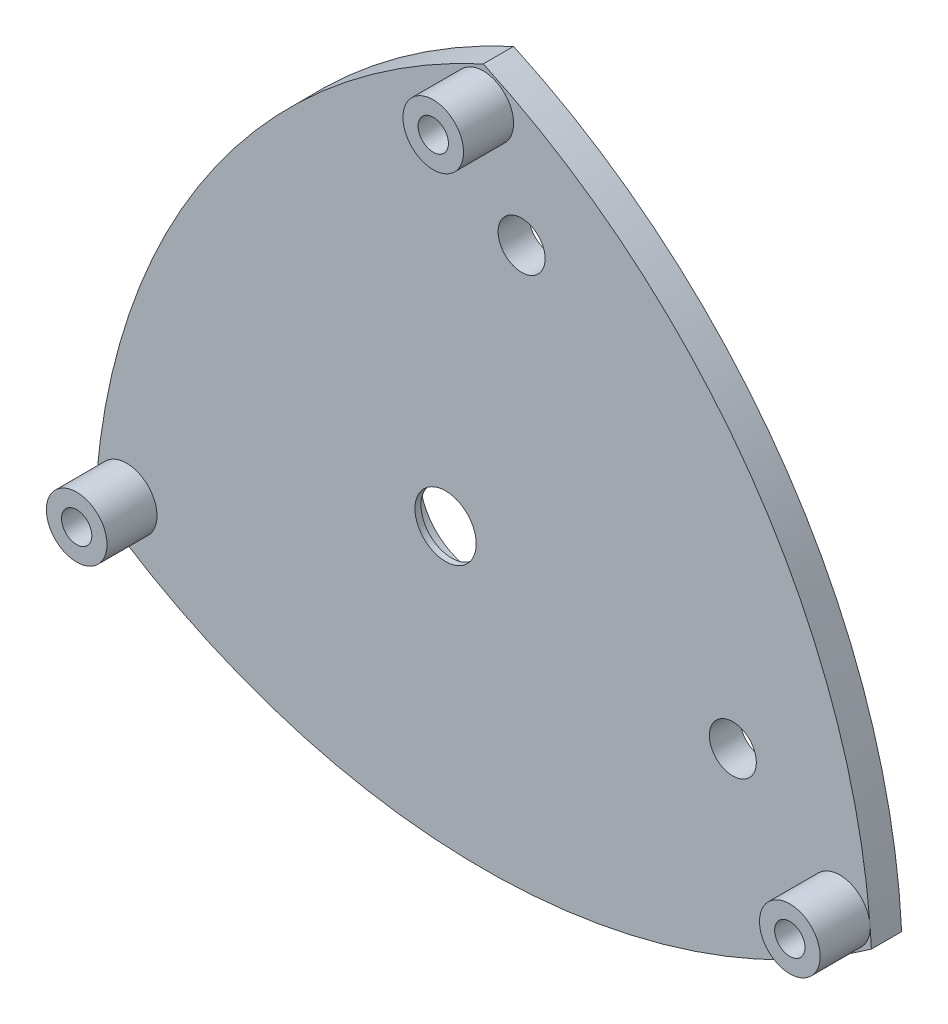
ISO-10303-21;
HEADER;
FILE_DESCRIPTION(('STEP AP214'),'2;1');
FILE_NAME('part.step','',(''),(''),'','','');
FILE_SCHEMA(('AUTOMOTIVE_DESIGN { 1 0 10303 214 1 1 1 1 }'));
ENDSEC;
DATA;
#1=APPLICATION_CONTEXT('core data for automotive mechanical design processes');
#2=APPLICATION_PROTOCOL_DEFINITION('international standard','automotive_design',2000,#1);
#3=PRODUCT_CONTEXT('',#1,'mechanical');
#4=PRODUCT('Part','Part','',(#3));
#5=PRODUCT_RELATED_PRODUCT_CATEGORY('part','',(#4));
#6=PRODUCT_DEFINITION_FORMATION('','',#4);
#7=PRODUCT_DEFINITION_CONTEXT('part definition',#1,'design');
#8=PRODUCT_DEFINITION('design','',#6,#7);
#9=PRODUCT_DEFINITION_SHAPE('','',#8);
#10=(LENGTH_UNIT() NAMED_UNIT(*) SI_UNIT(.MILLI.,.METRE.));
#11=(NAMED_UNIT(*) PLANE_ANGLE_UNIT() SI_UNIT($,.RADIAN.));
#12=(NAMED_UNIT(*) SI_UNIT($,.STERADIAN.) SOLID_ANGLE_UNIT());
#13=UNCERTAINTY_MEASURE_WITH_UNIT(LENGTH_MEASURE(1.E-05),#10,'distance_accuracy_value','');
#14=(GEOMETRIC_REPRESENTATION_CONTEXT(3) GLOBAL_UNCERTAINTY_ASSIGNED_CONTEXT((#13)) GLOBAL_UNIT_ASSIGNED_CONTEXT((#10,
#11,#12)) REPRESENTATION_CONTEXT('',''));
#15=CARTESIAN_POINT('',(0.,0.,0.));
#16=DIRECTION('',(0.,0.,1.));
#17=DIRECTION('',(1.,0.,0.));
#18=AXIS2_PLACEMENT_3D('',#15,#16,#17);
#19=CARTESIAN_POINT('',(-12.4288761987484,-23.2988029932106,10.));
#20=DIRECTION('',(0.,0.,-1.));
#21=DIRECTION('',(-1.,0.,0.));
#22=AXIS2_PLACEMENT_3D('',#19,#20,#21);
#23=CYLINDRICAL_SURFACE('',#22,18.50000000005);
#24=CARTESIAN_POINT('',(-12.4288761987484,-23.2988029932106,0.));
#25=DIRECTION('',(0.,0.,-1.));
#26=DIRECTION('',(-1.,0.,0.));
#27=AXIS2_PLACEMENT_3D('',#24,#25,#26);
#28=CIRCLE('',#27,18.50000000005);
#29=CARTESIAN_POINT('',(-30.9288761987984,-23.2988029932106,0.));
#30=VERTEX_POINT('',#29);
#31=EDGE_CURVE('E234',#30,#30,#28,.T.);
#32=ORIENTED_EDGE('',*,*,#31,.T.);
#33=EDGE_LOOP('',(#32));
#34=FACE_BOUND('',#33,.T.);
#35=CARTESIAN_POINT('',(-12.4288761987484,-23.2988029932106,8.));
#36=DIRECTION('',(0.,0.,1.));
#37=DIRECTION('',(1.,0.,0.));
#38=AXIS2_PLACEMENT_3D('',#35,#36,#37);
#39=CIRCLE('',#38,18.50000000005);
#40=CARTESIAN_POINT('',(6.07112380130153,-23.2988029932106,8.));
#41=VERTEX_POINT('',#40);
#42=EDGE_CURVE('E11',#41,#41,#39,.F.);
#43=ORIENTED_EDGE('',*,*,#42,.F.);
#44=EDGE_LOOP('',(#43));
#45=FACE_BOUND('',#44,.T.);
#46=ADVANCED_FACE('F35',(#34,#45),#23,.F.);
#47=CARTESIAN_POINT('',(-45.84945921808,10.0108651432086,10.));
#48=DIRECTION('',(0.,0.,1.));
#49=DIRECTION('',(1.,0.,0.));
#50=AXIS2_PLACEMENT_3D('',#47,#48,#49);
#51=PLANE('',#50);
#52=CARTESIAN_POINT('',(-12.4288761987484,-23.2988029932106,10.));
#53=DIRECTION('',(0.,0.,1.));
#54=DIRECTION('',(1.,0.,0.));
#55=AXIS2_PLACEMENT_3D('',#52,#53,#54);
#56=CIRCLE('',#55,10.10000000005);
#57=CARTESIAN_POINT('',(-2.32887619869847,-23.2988029932106,10.));
#58=VERTEX_POINT('',#57);
#59=EDGE_CURVE('E39',#58,#58,#56,.T.);
#60=ORIENTED_EDGE('',*,*,#59,.F.);
#61=EDGE_LOOP('',(#60));
#62=FACE_BOUND('',#61,.T.);
#63=CARTESIAN_POINT('',(12.6509950664096,69.515536741389,10.));
#64=DIRECTION('',(0.,0.,1.));
#65=DIRECTION('',(1.,0.,0.));
#66=AXIS2_PLACEMENT_3D('',#63,#64,#65);
#67=CIRCLE('',#66,7.75);
#68=CARTESIAN_POINT('',(20.4009950664096,69.515536741389,10.));
#69=VERTEX_POINT('',#68);
#70=EDGE_CURVE('E223',#69,#69,#67,.T.);
#71=ORIENTED_EDGE('',*,*,#70,.F.);
#72=EDGE_LOOP('',(#71));
#73=FACE_BOUND('',#72,.T.);
#74=CARTESIAN_POINT('',(82.3341256154374,-39.5307187826996,10.));
#75=DIRECTION('',(0.,0.,1.));
#76=DIRECTION('',(1.,0.,0.));
#77=AXIS2_PLACEMENT_3D('',#74,#75,#76);
#78=CIRCLE('',#77,7.74999999998308);
#79=CARTESIAN_POINT('',(90.0841256154205,-39.5307187826996,10.));
#80=VERTEX_POINT('',#79);
#81=EDGE_CURVE('E225',#80,#80,#78,.T.);
#82=ORIENTED_EDGE('',*,*,#81,.F.);
#83=EDGE_LOOP('',(#82));
#84=FACE_BOUND('',#83,.T.);
#85=CARTESIAN_POINT('',(0.,103.,10.));
#86=DIRECTION('',(0.,0.,1.));
#87=DIRECTION('',(1.,0.,0.));
#88=AXIS2_PLACEMENT_3D('',#85,#86,#87);
#89=CIRCLE('',#88,10.);
#90=CARTESIAN_POINT('',(9.99999999999999,103.,10.));
#91=VERTEX_POINT('',#90);
#92=EDGE_CURVE('E124',#91,#91,#89,.T.);
#93=ORIENTED_EDGE('',*,*,#92,.F.);
#94=EDGE_LOOP('',(#93));
#95=FACE_BOUND('',#94,.T.);
#96=CARTESIAN_POINT('',(-91.6989184361599,-84.9782697135829,10.));
#97=DIRECTION('',(0.,0.,1.));
#98=DIRECTION('',(1.,0.,0.));
#99=AXIS2_PLACEMENT_3D('',#96,#97,#98);
#100=CIRCLE('',#99,220.);
#101=CARTESIAN_POINT('',(128.022678921713,-73.9139281378286,10.));
#102=VERTEX_POINT('',#101);
#103=CARTESIAN_POINT('',(127.62978060665,-67.8049830104328,10.));
#104=VERTEX_POINT('',#103);
#105=EDGE_CURVE('E88',#102,#104,#100,.T.);
#106=ORIENTED_EDGE('',*,*,#105,.T.);
#107=CARTESIAN_POINT('',(117.630374076299,-67.9139281378286,10.));
#108=DIRECTION('',(0.,0.,1.));
#109=DIRECTION('',(1.,0.,0.));
#110=AXIS2_PLACEMENT_3D('',#107,#108,#109);
#111=CIRCLE('',#110,9.99999999999999);
#112=CARTESIAN_POINT('',(127.515403429057,-66.4019113736614,10.));
#113=VERTEX_POINT('',#112);
#114=EDGE_CURVE('E92',#113,#104,#111,.T.);
#115=ORIENTED_EDGE('',*,*,#114,.F.);
#116=CARTESIAN_POINT('',(0.,115.,10.));
#117=VERTEX_POINT('',#116);
#118=EDGE_CURVE('E82',#113,#117,#100,.T.);
#119=ORIENTED_EDGE('',*,*,#118,.T.);
#120=CARTESIAN_POINT('',(91.6989184361599,-84.9782697135829,10.));
#121=DIRECTION('',(0.,0.,1.));
#122=DIRECTION('',(-1.,0.,0.));
#123=AXIS2_PLACEMENT_3D('',#120,#121,#122);
#124=CIRCLE('',#123,220.);
#125=CARTESIAN_POINT('',(-127.515403429057,-66.4019113736608,10.));
#126=VERTEX_POINT('',#125);
#127=EDGE_CURVE('E143',#117,#126,#124,.T.);
#128=ORIENTED_EDGE('',*,*,#127,.T.);
#129=CARTESIAN_POINT('',(-117.630374076299,-67.9139281378286,10.));
#130=DIRECTION('',(0.,0.,1.));
#131=DIRECTION('',(1.,0.,0.));
#132=AXIS2_PLACEMENT_3D('',#129,#130,#131);
#133=CIRCLE('',#132,9.99999999999999);
#134=CARTESIAN_POINT('',(-127.62978060665,-67.8049830104333,10.));
#135=VERTEX_POINT('',#134);
#136=EDGE_CURVE('E113',#135,#126,#133,.T.);
#137=ORIENTED_EDGE('',*,*,#136,.F.);
#138=CARTESIAN_POINT('',(-128.022678921713,-73.9139281378286,10.));
#139=VERTEX_POINT('',#138);
#140=EDGE_CURVE('E142',#135,#139,#124,.T.);
#141=ORIENTED_EDGE('',*,*,#140,.T.);
#142=CARTESIAN_POINT('',(0.,105.,10.));
#143=DIRECTION('',(0.,0.,1.));
#144=DIRECTION('',(1.,0.,0.));
#145=AXIS2_PLACEMENT_3D('',#142,#143,#144);
#146=CIRCLE('',#145,220.);
#147=EDGE_CURVE('E89',#139,#102,#146,.T.);
#148=ORIENTED_EDGE('',*,*,#147,.T.);
#149=EDGE_LOOP('',(#106,#115,#119,#128,#137,#141,#148));
#150=FACE_BOUND('',#149,.T.);
#151=ADVANCED_FACE('F93',(#62,#73,#84,#95,#150),#51,.T.);
#152=CARTESIAN_POINT('',(-45.84945921808,10.0108651432086,0.));
#153=DIRECTION('',(0.,0.,1.));
#154=DIRECTION('',(1.,0.,0.));
#155=AXIS2_PLACEMENT_3D('',#152,#153,#154);
#156=PLANE('',#155);
#157=ORIENTED_EDGE('',*,*,#31,.F.);
#158=EDGE_LOOP('',(#157));
#159=FACE_BOUND('',#158,.T.);
#160=CARTESIAN_POINT('',(12.6509950664096,69.515536741389,0.));
#161=DIRECTION('',(0.,0.,-1.));
#162=DIRECTION('',(-1.,0.,0.));
#163=AXIS2_PLACEMENT_3D('',#160,#161,#162);
#164=CIRCLE('',#163,7.75);
#165=CARTESIAN_POINT('',(4.9009950664096,69.515536741389,0.));
#166=VERTEX_POINT('',#165);
#167=EDGE_CURVE('E230',#166,#166,#164,.T.);
#168=ORIENTED_EDGE('',*,*,#167,.F.);
#169=EDGE_LOOP('',(#168));
#170=FACE_BOUND('',#169,.T.);
#171=CARTESIAN_POINT('',(82.3341256154374,-39.5307187826996,0.));
#172=DIRECTION('',(0.,0.,-1.));
#173=DIRECTION('',(-1.,0.,0.));
#174=AXIS2_PLACEMENT_3D('',#171,#172,#173);
#175=CIRCLE('',#174,7.74999999998308);
#176=CARTESIAN_POINT('',(74.5841256154543,-39.5307187826996,0.));
#177=VERTEX_POINT('',#176);
#178=EDGE_CURVE('E231',#177,#177,#175,.T.);
#179=ORIENTED_EDGE('',*,*,#178,.F.);
#180=EDGE_LOOP('',(#179));
#181=FACE_BOUND('',#180,.T.);
#182=CARTESIAN_POINT('',(0.,105.,0.));
#183=DIRECTION('',(0.,0.,1.));
#184=DIRECTION('',(1.,0.,0.));
#185=AXIS2_PLACEMENT_3D('',#182,#183,#184);
#186=CIRCLE('',#185,220.);
#187=CARTESIAN_POINT('',(-128.022678921713,-73.9139281378286,0.));
#188=VERTEX_POINT('',#187);
#189=CARTESIAN_POINT('',(128.022678921713,-73.9139281378286,0.));
#190=VERTEX_POINT('',#189);
#191=EDGE_CURVE('E139',#188,#190,#186,.T.);
#192=ORIENTED_EDGE('',*,*,#191,.F.);
#193=CARTESIAN_POINT('',(91.6989184361599,-84.9782697135829,0.));
#194=DIRECTION('',(0.,0.,1.));
#195=DIRECTION('',(-1.,0.,0.));
#196=AXIS2_PLACEMENT_3D('',#193,#194,#195);
#197=CIRCLE('',#196,220.);
#198=CARTESIAN_POINT('',(0.,115.,0.));
#199=VERTEX_POINT('',#198);
#200=EDGE_CURVE('E140',#199,#188,#197,.T.);
#201=ORIENTED_EDGE('',*,*,#200,.F.);
#202=CARTESIAN_POINT('',(-91.6989184361599,-84.9782697135829,0.));
#203=DIRECTION('',(0.,0.,1.));
#204=DIRECTION('',(1.,0.,0.));
#205=AXIS2_PLACEMENT_3D('',#202,#203,#204);
#206=CIRCLE('',#205,220.);
#207=EDGE_CURVE('E148',#190,#199,#206,.T.);
#208=ORIENTED_EDGE('',*,*,#207,.F.);
#209=EDGE_LOOP('',(#192,#201,#208));
#210=FACE_BOUND('',#209,.T.);
#211=CARTESIAN_POINT('',(-117.630374076299,-67.9139281378286,0.));
#212=DIRECTION('',(0.,0.,1.));
#213=DIRECTION('',(1.,0.,0.));
#214=AXIS2_PLACEMENT_3D('',#211,#212,#213);
#215=CIRCLE('',#214,5.00000000000002);
#216=CARTESIAN_POINT('',(-112.630374076299,-67.9139281378286,0.));
#217=VERTEX_POINT('',#216);
#218=EDGE_CURVE('E136',#217,#217,#215,.T.);
#219=ORIENTED_EDGE('',*,*,#218,.T.);
#220=EDGE_LOOP('',(#219));
#221=FACE_BOUND('',#220,.T.);
#222=CARTESIAN_POINT('',(117.630374076299,-67.9139281378286,0.));
#223=DIRECTION('',(0.,0.,1.));
#224=DIRECTION('',(1.,0.,0.));
#225=AXIS2_PLACEMENT_3D('',#222,#223,#224);
#226=CIRCLE('',#225,5.00000000000013);
#227=CARTESIAN_POINT('',(122.630374076299,-67.9139281378286,0.));
#228=VERTEX_POINT('',#227);
#229=EDGE_CURVE('E133',#228,#228,#226,.T.);
#230=ORIENTED_EDGE('',*,*,#229,.T.);
#231=EDGE_LOOP('',(#230));
#232=FACE_BOUND('',#231,.T.);
#233=CARTESIAN_POINT('',(0.,103.,0.));
#234=DIRECTION('',(0.,0.,1.));
#235=DIRECTION('',(1.,0.,0.));
#236=AXIS2_PLACEMENT_3D('',#233,#234,#235);
#237=CIRCLE('',#236,5.00000000000001);
#238=CARTESIAN_POINT('',(5.,103.,0.));
#239=VERTEX_POINT('',#238);
#240=EDGE_CURVE('E128',#239,#239,#237,.T.);
#241=ORIENTED_EDGE('',*,*,#240,.T.);
#242=EDGE_LOOP('',(#241));
#243=FACE_BOUND('',#242,.T.);
#244=ADVANCED_FACE('F162',(#159,#170,#181,#210,#221,#232,#243),#156,.F.);
#245=CARTESIAN_POINT('',(0.,105.,10.));
#246=DIRECTION('',(0.,0.,-1.));
#247=DIRECTION('',(-1.,0.,0.));
#248=AXIS2_PLACEMENT_3D('',#245,#246,#247);
#249=CYLINDRICAL_SURFACE('',#248,220.);
#250=ORIENTED_EDGE('',*,*,#191,.T.);
#251=DIRECTION('',(0.,0.,-1.));
#252=VECTOR('',#251,1.);
#253=CARTESIAN_POINT('',(128.022678921713,-73.9139281378286,10.));
#254=LINE('',#253,#252);
#255=EDGE_CURVE('E44',#102,#190,#254,.T.);
#256=ORIENTED_EDGE('',*,*,#255,.F.);
#257=ORIENTED_EDGE('',*,*,#147,.F.);
#258=DIRECTION('',(0.,0.,-1.));
#259=VECTOR('',#258,1.);
#260=CARTESIAN_POINT('',(-128.022678921713,-73.9139281378286,10.));
#261=LINE('',#260,#259);
#262=EDGE_CURVE('E145',#139,#188,#261,.T.);
#263=ORIENTED_EDGE('',*,*,#262,.T.);
#264=EDGE_LOOP('',(#250,#256,#257,#263));
#265=FACE_BOUND('',#264,.T.);
#266=ADVANCED_FACE('F37',(#265),#249,.T.);
#267=CARTESIAN_POINT('',(-91.6989184361599,-84.9782697135829,10.));
#268=DIRECTION('',(0.,0.,-1.));
#269=DIRECTION('',(-1.,0.,0.));
#270=AXIS2_PLACEMENT_3D('',#267,#268,#269);
#271=CYLINDRICAL_SURFACE('',#270,220.);
#272=ORIENTED_EDGE('',*,*,#207,.T.);
#273=DIRECTION('',(0.,0.,-1.));
#274=VECTOR('',#273,1.);
#275=CARTESIAN_POINT('',(0.,115.,10.));
#276=LINE('',#275,#274);
#277=EDGE_CURVE('E86',#117,#199,#276,.T.);
#278=ORIENTED_EDGE('',*,*,#277,.F.);
#279=ORIENTED_EDGE('',*,*,#118,.F.);
#280=CARTESIAN_POINT('',(-91.6989184361599,-84.9782697135829,10.));
#281=DIRECTION('',(0.,0.,1.));
#282=DIRECTION('',(1.,0.,0.));
#283=AXIS2_PLACEMENT_3D('',#280,#281,#282);
#284=CIRCLE('',#283,220.);
#285=EDGE_CURVE('E51',#104,#113,#284,.T.);
#286=ORIENTED_EDGE('',*,*,#285,.F.);
#287=ORIENTED_EDGE('',*,*,#105,.F.);
#288=ORIENTED_EDGE('',*,*,#255,.T.);
#289=EDGE_LOOP('',(#272,#278,#279,#286,#287,#288));
#290=FACE_BOUND('',#289,.T.);
#291=ADVANCED_FACE('F84',(#290),#271,.T.);
#292=CARTESIAN_POINT('',(91.6989184361599,-84.9782697135829,10.));
#293=DIRECTION('',(0.,0.,-1.));
#294=DIRECTION('',(-1.,0.,0.));
#295=AXIS2_PLACEMENT_3D('',#292,#293,#294);
#296=CYLINDRICAL_SURFACE('',#295,220.);
#297=ORIENTED_EDGE('',*,*,#200,.T.);
#298=ORIENTED_EDGE('',*,*,#262,.F.);
#299=ORIENTED_EDGE('',*,*,#140,.F.);
#300=CARTESIAN_POINT('',(91.6989184361599,-84.9782697135829,10.));
#301=DIRECTION('',(0.,0.,1.));
#302=DIRECTION('',(1.,0.,0.));
#303=AXIS2_PLACEMENT_3D('',#300,#301,#302);
#304=CIRCLE('',#303,220.);
#305=EDGE_CURVE('E59',#126,#135,#304,.T.);
#306=ORIENTED_EDGE('',*,*,#305,.F.);
#307=ORIENTED_EDGE('',*,*,#127,.F.);
#308=ORIENTED_EDGE('',*,*,#277,.T.);
#309=EDGE_LOOP('',(#297,#298,#299,#306,#307,#308));
#310=FACE_BOUND('',#309,.T.);
#311=ADVANCED_FACE('F164',(#310),#296,.T.);
#312=CARTESIAN_POINT('',(-117.630374076299,-67.9139281378286,10.));
#313=DIRECTION('',(0.,0.,-1.));
#314=DIRECTION('',(-1.,0.,0.));
#315=AXIS2_PLACEMENT_3D('',#312,#313,#314);
#316=CYLINDRICAL_SURFACE('',#315,5.00000000000002);
#317=ORIENTED_EDGE('',*,*,#218,.F.);
#318=EDGE_LOOP('',(#317));
#319=FACE_BOUND('',#318,.T.);
#320=CARTESIAN_POINT('',(-117.630374076299,-67.9139281378286,26.5));
#321=DIRECTION('',(0.,0.,1.));
#322=DIRECTION('',(1.,0.,0.));
#323=AXIS2_PLACEMENT_3D('',#320,#321,#322);
#324=CIRCLE('',#323,5.00000000000001);
#325=CARTESIAN_POINT('',(-112.630374076299,-67.9139281378286,26.5));
#326=VERTEX_POINT('',#325);
#327=EDGE_CURVE('E103',#326,#326,#324,.T.);
#328=ORIENTED_EDGE('',*,*,#327,.T.);
#329=EDGE_LOOP('',(#328));
#330=FACE_BOUND('',#329,.T.);
#331=ADVANCED_FACE('F267',(#319,#330),#316,.F.);
#332=CARTESIAN_POINT('',(117.630374076299,-67.9139281378286,10.));
#333=DIRECTION('',(0.,0.,-1.));
#334=DIRECTION('',(-1.,0.,0.));
#335=AXIS2_PLACEMENT_3D('',#332,#333,#334);
#336=CYLINDRICAL_SURFACE('',#335,5.00000000000013);
#337=ORIENTED_EDGE('',*,*,#229,.F.);
#338=EDGE_LOOP('',(#337));
#339=FACE_BOUND('',#338,.T.);
#340=CARTESIAN_POINT('',(117.630374076299,-67.9139281378286,26.5));
#341=DIRECTION('',(0.,0.,1.));
#342=DIRECTION('',(1.,0.,0.));
#343=AXIS2_PLACEMENT_3D('',#340,#341,#342);
#344=CIRCLE('',#343,5.00000000000003);
#345=CARTESIAN_POINT('',(122.630374076299,-67.9139281378286,26.5));
#346=VERTEX_POINT('',#345);
#347=EDGE_CURVE('E99',#346,#346,#344,.T.);
#348=ORIENTED_EDGE('',*,*,#347,.T.);
#349=EDGE_LOOP('',(#348));
#350=FACE_BOUND('',#349,.T.);
#351=ADVANCED_FACE('F283',(#339,#350),#336,.F.);
#352=CARTESIAN_POINT('',(0.,103.,10.));
#353=DIRECTION('',(0.,0.,-1.));
#354=DIRECTION('',(-1.,0.,0.));
#355=AXIS2_PLACEMENT_3D('',#352,#353,#354);
#356=CYLINDRICAL_SURFACE('',#355,5.00000000000001);
#357=ORIENTED_EDGE('',*,*,#240,.F.);
#358=EDGE_LOOP('',(#357));
#359=FACE_BOUND('',#358,.T.);
#360=CARTESIAN_POINT('',(0.,103.,26.5));
#361=DIRECTION('',(0.,0.,1.));
#362=DIRECTION('',(1.,0.,0.));
#363=AXIS2_PLACEMENT_3D('',#360,#361,#362);
#364=CIRCLE('',#363,5.00000000000001);
#365=CARTESIAN_POINT('',(5.,103.,26.5));
#366=VERTEX_POINT('',#365);
#367=EDGE_CURVE('E121',#366,#366,#364,.T.);
#368=ORIENTED_EDGE('',*,*,#367,.T.);
#369=EDGE_LOOP('',(#368));
#370=FACE_BOUND('',#369,.T.);
#371=ADVANCED_FACE('F290',(#359,#370),#356,.F.);
#372=CARTESIAN_POINT('',(0.,103.,26.5));
#373=DIRECTION('',(0.,0.,1.));
#374=DIRECTION('',(1.,0.,0.));
#375=AXIS2_PLACEMENT_3D('',#372,#373,#374);
#376=PLANE('',#375);
#377=CARTESIAN_POINT('',(0.,103.,26.5));
#378=DIRECTION('',(0.,0.,1.));
#379=DIRECTION('',(1.,0.,0.));
#380=AXIS2_PLACEMENT_3D('',#377,#378,#379);
#381=CIRCLE('',#380,10.);
#382=CARTESIAN_POINT('',(9.99999999999999,103.,26.5));
#383=VERTEX_POINT('',#382);
#384=EDGE_CURVE('E125',#383,#383,#381,.T.);
#385=ORIENTED_EDGE('',*,*,#384,.T.);
#386=EDGE_LOOP('',(#385));
#387=FACE_BOUND('',#386,.T.);
#388=ORIENTED_EDGE('',*,*,#367,.F.);
#389=EDGE_LOOP('',(#388));
#390=FACE_BOUND('',#389,.T.);
#391=ADVANCED_FACE('F182',(#387,#390),#376,.T.);
#392=CARTESIAN_POINT('',(0.,103.,26.5));
#393=DIRECTION('',(0.,0.,-1.));
#394=DIRECTION('',(-1.,0.,0.));
#395=AXIS2_PLACEMENT_3D('',#392,#393,#394);
#396=CYLINDRICAL_SURFACE('',#395,10.);
#397=ORIENTED_EDGE('',*,*,#384,.F.);
#398=EDGE_LOOP('',(#397));
#399=FACE_BOUND('',#398,.T.);
#400=ORIENTED_EDGE('',*,*,#92,.T.);
#401=EDGE_LOOP('',(#400));
#402=FACE_BOUND('',#401,.T.);
#403=ADVANCED_FACE('F174',(#399,#402),#396,.T.);
#404=CARTESIAN_POINT('',(-117.630374076299,-67.9139281378286,10.));
#405=DIRECTION('',(0.,0.,1.));
#406=DIRECTION('',(1.,0.,0.));
#407=AXIS2_PLACEMENT_3D('',#404,#405,#406);
#408=PLANE('',#407);
#409=EDGE_CURVE('E117',#126,#135,#133,.T.);
#410=ORIENTED_EDGE('',*,*,#409,.F.);
#411=ORIENTED_EDGE('',*,*,#305,.T.);
#412=EDGE_LOOP('',(#410,#411));
#413=FACE_BOUND('',#412,.T.);
#414=ADVANCED_FACE('F171',(#413),#408,.F.);
#415=CARTESIAN_POINT('',(-117.630374076299,-67.9139281378286,26.5));
#416=DIRECTION('',(0.,0.,1.));
#417=DIRECTION('',(1.,0.,0.));
#418=AXIS2_PLACEMENT_3D('',#415,#416,#417);
#419=PLANE('',#418);
#420=CARTESIAN_POINT('',(-117.630374076299,-67.9139281378286,26.5));
#421=DIRECTION('',(0.,0.,1.));
#422=DIRECTION('',(1.,0.,0.));
#423=AXIS2_PLACEMENT_3D('',#420,#421,#422);
#424=CIRCLE('',#423,9.99999999999999);
#425=CARTESIAN_POINT('',(-107.630374076299,-67.9139281378286,26.5));
#426=VERTEX_POINT('',#425);
#427=EDGE_CURVE('E114',#426,#426,#424,.T.);
#428=ORIENTED_EDGE('',*,*,#427,.T.);
#429=EDGE_LOOP('',(#428));
#430=FACE_BOUND('',#429,.T.);
#431=ORIENTED_EDGE('',*,*,#327,.F.);
#432=EDGE_LOOP('',(#431));
#433=FACE_BOUND('',#432,.T.);
#434=ADVANCED_FACE('F173',(#430,#433),#419,.T.);
#435=CARTESIAN_POINT('',(-117.630374076299,-67.9139281378286,26.5));
#436=DIRECTION('',(0.,0.,-1.));
#437=DIRECTION('',(-1.,0.,0.));
#438=AXIS2_PLACEMENT_3D('',#435,#436,#437);
#439=CYLINDRICAL_SURFACE('',#438,9.99999999999999);
#440=ORIENTED_EDGE('',*,*,#427,.F.);
#441=EDGE_LOOP('',(#440));
#442=FACE_BOUND('',#441,.T.);
#443=ORIENTED_EDGE('',*,*,#409,.T.);
#444=ORIENTED_EDGE('',*,*,#136,.T.);
#445=EDGE_LOOP('',(#443,#444));
#446=FACE_BOUND('',#445,.T.);
#447=ADVANCED_FACE('F169',(#442,#446),#439,.T.);
#448=CARTESIAN_POINT('',(117.630374076299,-67.9139281378286,10.));
#449=DIRECTION('',(0.,0.,1.));
#450=DIRECTION('',(1.,0.,0.));
#451=AXIS2_PLACEMENT_3D('',#448,#449,#450);
#452=PLANE('',#451);
#453=EDGE_CURVE('E98',#104,#113,#111,.T.);
#454=ORIENTED_EDGE('',*,*,#453,.F.);
#455=ORIENTED_EDGE('',*,*,#285,.T.);
#456=EDGE_LOOP('',(#454,#455));
#457=FACE_BOUND('',#456,.T.);
#458=ADVANCED_FACE('F102',(#457),#452,.F.);
#459=CARTESIAN_POINT('',(117.630374076299,-67.9139281378286,26.5));
#460=DIRECTION('',(0.,0.,1.));
#461=DIRECTION('',(1.,0.,0.));
#462=AXIS2_PLACEMENT_3D('',#459,#460,#461);
#463=PLANE('',#462);
#464=CARTESIAN_POINT('',(117.630374076299,-67.9139281378286,26.5));
#465=DIRECTION('',(0.,0.,1.));
#466=DIRECTION('',(1.,0.,0.));
#467=AXIS2_PLACEMENT_3D('',#464,#465,#466);
#468=CIRCLE('',#467,9.99999999999999);
#469=CARTESIAN_POINT('',(127.630374076299,-67.9139281378286,26.5));
#470=VERTEX_POINT('',#469);
#471=EDGE_CURVE('E104',#470,#470,#468,.T.);
#472=ORIENTED_EDGE('',*,*,#471,.T.);
#473=EDGE_LOOP('',(#472));
#474=FACE_BOUND('',#473,.T.);
#475=ORIENTED_EDGE('',*,*,#347,.F.);
#476=EDGE_LOOP('',(#475));
#477=FACE_BOUND('',#476,.T.);
#478=ADVANCED_FACE('F208',(#474,#477),#463,.T.);
#479=CARTESIAN_POINT('',(117.630374076299,-67.9139281378286,26.5));
#480=DIRECTION('',(0.,0.,-1.));
#481=DIRECTION('',(-1.,0.,0.));
#482=AXIS2_PLACEMENT_3D('',#479,#480,#481);
#483=CYLINDRICAL_SURFACE('',#482,9.99999999999999);
#484=ORIENTED_EDGE('',*,*,#471,.F.);
#485=EDGE_LOOP('',(#484));
#486=FACE_BOUND('',#485,.T.);
#487=ORIENTED_EDGE('',*,*,#453,.T.);
#488=ORIENTED_EDGE('',*,*,#114,.T.);
#489=EDGE_LOOP('',(#487,#488));
#490=FACE_BOUND('',#489,.T.);
#491=ADVANCED_FACE('F106',(#486,#490),#483,.T.);
#492=CARTESIAN_POINT('',(82.3341256154374,-39.5307187826996,15.));
#493=DIRECTION('',(0.,0.,-1.));
#494=DIRECTION('',(-1.,0.,0.));
#495=AXIS2_PLACEMENT_3D('',#492,#493,#494);
#496=CYLINDRICAL_SURFACE('',#495,7.74999999998308);
#497=ORIENTED_EDGE('',*,*,#81,.T.);
#498=EDGE_LOOP('',(#497));
#499=FACE_BOUND('',#498,.T.);
#500=ORIENTED_EDGE('',*,*,#178,.T.);
#501=EDGE_LOOP('',(#500));
#502=FACE_BOUND('',#501,.T.);
#503=ADVANCED_FACE('F203',(#499,#502),#496,.F.);
#504=CARTESIAN_POINT('',(12.6509950664096,69.515536741389,15.));
#505=DIRECTION('',(0.,0.,-1.));
#506=DIRECTION('',(-1.,0.,0.));
#507=AXIS2_PLACEMENT_3D('',#504,#505,#506);
#508=CYLINDRICAL_SURFACE('',#507,7.75);
#509=ORIENTED_EDGE('',*,*,#70,.T.);
#510=EDGE_LOOP('',(#509));
#511=FACE_BOUND('',#510,.T.);
#512=ORIENTED_EDGE('',*,*,#167,.T.);
#513=EDGE_LOOP('',(#512));
#514=FACE_BOUND('',#513,.T.);
#515=ADVANCED_FACE('F200',(#511,#514),#508,.F.);
#516=CARTESIAN_POINT('',(-12.4288761987484,-23.2988029932106,8.));
#517=DIRECTION('',(0.,0.,1.));
#518=DIRECTION('',(1.,0.,0.));
#519=AXIS2_PLACEMENT_3D('',#516,#517,#518);
#520=PLANE('',#519);
#521=CARTESIAN_POINT('',(-12.4288761987484,-23.2988029932106,8.));
#522=DIRECTION('',(0.,0.,-1.));
#523=DIRECTION('',(-1.,0.,0.));
#524=AXIS2_PLACEMENT_3D('',#521,#522,#523);
#525=CIRCLE('',#524,10.10000000005);
#526=CARTESIAN_POINT('',(-22.5288761987984,-23.2988029932106,8.));
#527=VERTEX_POINT('',#526);
#528=EDGE_CURVE('E238',#527,#527,#525,.T.);
#529=ORIENTED_EDGE('',*,*,#528,.F.);
#530=EDGE_LOOP('',(#529));
#531=FACE_BOUND('',#530,.T.);
#532=ORIENTED_EDGE('',*,*,#42,.T.);
#533=EDGE_LOOP('',(#532));
#534=FACE_BOUND('',#533,.T.);
#535=ADVANCED_FACE('F198',(#531,#534),#520,.F.);
#536=CARTESIAN_POINT('',(-12.4288761987484,-23.2988029932106,16.));
#537=DIRECTION('',(0.,0.,-1.));
#538=DIRECTION('',(-1.,0.,0.));
#539=AXIS2_PLACEMENT_3D('',#536,#537,#538);
#540=CYLINDRICAL_SURFACE('',#539,10.10000000005);
#541=ORIENTED_EDGE('',*,*,#59,.T.);
#542=EDGE_LOOP('',(#541));
#543=FACE_BOUND('',#542,.T.);
#544=ORIENTED_EDGE('',*,*,#528,.T.);
#545=EDGE_LOOP('',(#544));
#546=FACE_BOUND('',#545,.T.);
#547=ADVANCED_FACE('F245',(#543,#546),#540,.F.);
#548=CLOSED_SHELL('',(#46,#151,#244,#266,#291,#311,#331,#351,#371,#391,#403,#414,#434,#447,#458,
#478,#491,#503,#515,#535,#547));
#549=MANIFOLD_SOLID_BREP('B2',#548);
#550=ADVANCED_BREP_SHAPE_REPRESENTATION('',(#18,#549),#14);
#551=SHAPE_DEFINITION_REPRESENTATION(#9,#550);
ENDSEC;
END-ISO-10303-21;
